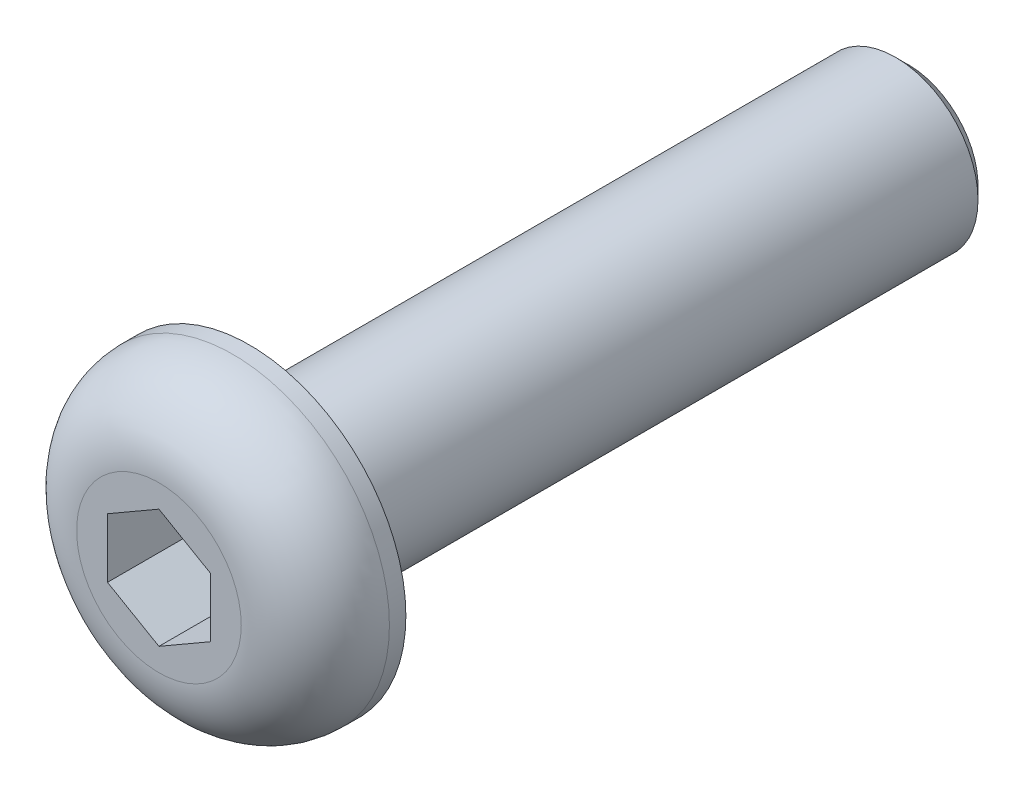
ISO-10303-21;
HEADER;
FILE_DESCRIPTION(('STEP AP214'),'2;1');
FILE_NAME('part.step','',(''),(''),'','','');
FILE_SCHEMA(('AUTOMOTIVE_DESIGN { 1 0 10303 214 1 1 1 1 }'));
ENDSEC;
DATA;
#1=APPLICATION_CONTEXT('core data for automotive mechanical design processes');
#2=APPLICATION_PROTOCOL_DEFINITION('international standard','automotive_design',2000,#1);
#3=PRODUCT_CONTEXT('',#1,'mechanical');
#4=PRODUCT('Part','Part','',(#3));
#5=PRODUCT_RELATED_PRODUCT_CATEGORY('part','',(#4));
#6=PRODUCT_DEFINITION_FORMATION('','',#4);
#7=PRODUCT_DEFINITION_CONTEXT('part definition',#1,'design');
#8=PRODUCT_DEFINITION('design','',#6,#7);
#9=PRODUCT_DEFINITION_SHAPE('','',#8);
#10=(LENGTH_UNIT() NAMED_UNIT(*) SI_UNIT(.MILLI.,.METRE.));
#11=(NAMED_UNIT(*) PLANE_ANGLE_UNIT() SI_UNIT($,.RADIAN.));
#12=(NAMED_UNIT(*) SI_UNIT($,.STERADIAN.) SOLID_ANGLE_UNIT());
#13=UNCERTAINTY_MEASURE_WITH_UNIT(LENGTH_MEASURE(1.E-05),#10,'distance_accuracy_value','');
#14=(GEOMETRIC_REPRESENTATION_CONTEXT(3) GLOBAL_UNCERTAINTY_ASSIGNED_CONTEXT((#13)) GLOBAL_UNIT_ASSIGNED_CONTEXT((#10,
#11,#12)) REPRESENTATION_CONTEXT('',''));
#15=CARTESIAN_POINT('',(0.,0.,0.));
#16=DIRECTION('',(0.,0.,1.));
#17=DIRECTION('',(1.,0.,0.));
#18=AXIS2_PLACEMENT_3D('',#15,#16,#17);
#19=CARTESIAN_POINT('',(0.,0.,0.));
#20=DIRECTION('',(0.,0.,1.));
#21=DIRECTION('',(1.,0.,0.));
#22=AXIS2_PLACEMENT_3D('',#19,#20,#21);
#23=PLANE('',#22);
#24=CARTESIAN_POINT('',(0.,0.,0.));
#25=DIRECTION('',(0.,0.,1.));
#26=DIRECTION('',(1.,0.,0.));
#27=AXIS2_PLACEMENT_3D('',#24,#25,#26);
#28=CIRCLE('',#27,3.8);
#29=CARTESIAN_POINT('',(3.8,0.,0.));
#30=VERTEX_POINT('',#29);
#31=EDGE_CURVE('E136',#30,#30,#28,.T.);
#32=ORIENTED_EDGE('',*,*,#31,.F.);
#33=EDGE_LOOP('',(#32));
#34=FACE_BOUND('',#33,.T.);
#35=CARTESIAN_POINT('',(0.,0.,0.));
#36=DIRECTION('',(0.,0.,1.));
#37=DIRECTION('',(1.,0.,0.));
#38=AXIS2_PLACEMENT_3D('',#35,#36,#37);
#39=CIRCLE('',#38,2.);
#40=CARTESIAN_POINT('',(2.,0.,0.));
#41=VERTEX_POINT('',#40);
#42=EDGE_CURVE('E144',#41,#41,#39,.F.);
#43=ORIENTED_EDGE('',*,*,#42,.F.);
#44=EDGE_LOOP('',(#43));
#45=FACE_BOUND('',#44,.T.);
#46=ADVANCED_FACE('F34',(#34,#45),#23,.F.);
#47=CARTESIAN_POINT('',(0.,0.,2.2));
#48=DIRECTION('',(0.,0.,-1.));
#49=DIRECTION('',(-1.,0.,0.));
#50=AXIS2_PLACEMENT_3D('',#47,#48,#49);
#51=CYLINDRICAL_SURFACE('',#50,3.8);
#52=CARTESIAN_POINT('',(0.,0.,0.4));
#53=DIRECTION('',(0.,0.,1.));
#54=DIRECTION('',(1.,0.,0.));
#55=AXIS2_PLACEMENT_3D('',#52,#53,#54);
#56=CIRCLE('',#55,3.8);
#57=CARTESIAN_POINT('',(3.8,0.,0.4));
#58=VERTEX_POINT('',#57);
#59=EDGE_CURVE('E11',#58,#58,#56,.F.);
#60=ORIENTED_EDGE('',*,*,#59,.T.);
#61=EDGE_LOOP('',(#60));
#62=FACE_BOUND('',#61,.T.);
#63=ORIENTED_EDGE('',*,*,#31,.T.);
#64=EDGE_LOOP('',(#63));
#65=FACE_BOUND('',#64,.T.);
#66=ADVANCED_FACE('F167',(#62,#65),#51,.T.);
#67=CARTESIAN_POINT('',(0.,0.,2.2));
#68=DIRECTION('',(0.,0.,1.));
#69=DIRECTION('',(1.,0.,0.));
#70=AXIS2_PLACEMENT_3D('',#67,#68,#69);
#71=PLANE('',#70);
#72=CARTESIAN_POINT('',(0.,0.,2.2));
#73=DIRECTION('',(0.,0.,1.));
#74=DIRECTION('',(1.,0.,0.));
#75=AXIS2_PLACEMENT_3D('',#72,#73,#74);
#76=CIRCLE('',#75,2.);
#77=CARTESIAN_POINT('',(2.,0.,2.2));
#78=VERTEX_POINT('',#77);
#79=EDGE_CURVE('E42',#78,#78,#76,.T.);
#80=ORIENTED_EDGE('',*,*,#79,.T.);
#81=EDGE_LOOP('',(#80));
#82=FACE_BOUND('',#81,.T.);
#83=DIRECTION('',(-0.866025403784439,0.5,0.));
#84=VECTOR('',#83,1.);
#85=CARTESIAN_POINT('',(1.25,0.721687836487033,2.2));
#86=LINE('',#85,#84);
#87=CARTESIAN_POINT('',(1.25,0.721687836487033,2.2));
#88=VERTEX_POINT('',#87);
#89=CARTESIAN_POINT('',(0.,1.44337567297406,2.2));
#90=VERTEX_POINT('',#89);
#91=EDGE_CURVE('E49',#88,#90,#86,.T.);
#92=ORIENTED_EDGE('',*,*,#91,.F.);
#93=DIRECTION('',(0.,1.,0.));
#94=VECTOR('',#93,1.);
#95=CARTESIAN_POINT('',(1.25,-0.721687836487033,2.2));
#96=LINE('',#95,#94);
#97=CARTESIAN_POINT('',(1.25,-0.721687836487033,2.2));
#98=VERTEX_POINT('',#97);
#99=EDGE_CURVE('E132',#98,#88,#96,.T.);
#100=ORIENTED_EDGE('',*,*,#99,.F.);
#101=DIRECTION('',(0.866025403784439,0.5,0.));
#102=VECTOR('',#101,1.);
#103=CARTESIAN_POINT('',(0.,-1.44337567297406,2.2));
#104=LINE('',#103,#102);
#105=CARTESIAN_POINT('',(0.,-1.44337567297406,2.2));
#106=VERTEX_POINT('',#105);
#107=EDGE_CURVE('E130',#106,#98,#104,.T.);
#108=ORIENTED_EDGE('',*,*,#107,.F.);
#109=DIRECTION('',(0.866025403784439,-0.5,0.));
#110=VECTOR('',#109,1.);
#111=CARTESIAN_POINT('',(-1.25,-0.721687836487032,2.2));
#112=LINE('',#111,#110);
#113=CARTESIAN_POINT('',(-1.25,-0.721687836487032,2.2));
#114=VERTEX_POINT('',#113);
#115=EDGE_CURVE('E97',#114,#106,#112,.T.);
#116=ORIENTED_EDGE('',*,*,#115,.F.);
#117=DIRECTION('',(0.,-1.,0.));
#118=VECTOR('',#117,1.);
#119=CARTESIAN_POINT('',(-1.25,0.721687836487033,2.2));
#120=LINE('',#119,#118);
#121=CARTESIAN_POINT('',(-1.25,0.721687836487033,2.2));
#122=VERTEX_POINT('',#121);
#123=EDGE_CURVE('E126',#122,#114,#120,.T.);
#124=ORIENTED_EDGE('',*,*,#123,.F.);
#125=DIRECTION('',(-0.866025403784439,-0.5,0.));
#126=VECTOR('',#125,1.);
#127=CARTESIAN_POINT('',(0.,1.44337567297406,2.2));
#128=LINE('',#127,#126);
#129=EDGE_CURVE('E123',#90,#122,#128,.T.);
#130=ORIENTED_EDGE('',*,*,#129,.F.);
#131=EDGE_LOOP('',(#92,#100,#108,#116,#124,#130));
#132=FACE_BOUND('',#131,.T.);
#133=ADVANCED_FACE('F155',(#82,#132),#71,.T.);
#134=CARTESIAN_POINT('',(0.,0.,-16.));
#135=DIRECTION('',(0.,0.,1.));
#136=DIRECTION('',(1.,0.,0.));
#137=AXIS2_PLACEMENT_3D('',#134,#135,#136);
#138=CYLINDRICAL_SURFACE('',#137,2.);
#139=CARTESIAN_POINT('',(0.,0.,-15.7));
#140=DIRECTION('',(0.,0.,-1.));
#141=DIRECTION('',(-1.,0.,0.));
#142=AXIS2_PLACEMENT_3D('',#139,#140,#141);
#143=CIRCLE('',#142,2.);
#144=CARTESIAN_POINT('',(-2.,0.,-15.7));
#145=VERTEX_POINT('',#144);
#146=EDGE_CURVE('E150',#145,#145,#143,.F.);
#147=ORIENTED_EDGE('',*,*,#146,.T.);
#148=EDGE_LOOP('',(#147));
#149=FACE_BOUND('',#148,.T.);
#150=ORIENTED_EDGE('',*,*,#42,.T.);
#151=EDGE_LOOP('',(#150));
#152=FACE_BOUND('',#151,.T.);
#153=ADVANCED_FACE('F190',(#149,#152),#138,.T.);
#154=CARTESIAN_POINT('',(0.,0.,-16.));
#155=DIRECTION('',(0.,0.,-1.));
#156=DIRECTION('',(-1.,0.,0.));
#157=AXIS2_PLACEMENT_3D('',#154,#155,#156);
#158=PLANE('',#157);
#159=CARTESIAN_POINT('',(0.,0.,-16.));
#160=DIRECTION('',(0.,0.,-1.));
#161=DIRECTION('',(-1.,0.,0.));
#162=AXIS2_PLACEMENT_3D('',#159,#160,#161);
#163=CIRCLE('',#162,1.70000000000001);
#164=CARTESIAN_POINT('',(-1.70000000000001,0.,-16.));
#165=VERTEX_POINT('',#164);
#166=EDGE_CURVE('E147',#165,#165,#163,.T.);
#167=ORIENTED_EDGE('',*,*,#166,.T.);
#168=EDGE_LOOP('',(#167));
#169=FACE_BOUND('',#168,.T.);
#170=ADVANCED_FACE('F182',(#169),#158,.T.);
#171=CARTESIAN_POINT('',(0.,0.,-16.));
#172=DIRECTION('',(0.,0.,1.));
#173=DIRECTION('',(1.,0.,0.));
#174=AXIS2_PLACEMENT_3D('',#171,#172,#173);
#175=CONICAL_SURFACE('',#174,1.70000000000001,0.785398163397443);
#176=ORIENTED_EDGE('',*,*,#146,.F.);
#177=EDGE_LOOP('',(#176));
#178=FACE_BOUND('',#177,.T.);
#179=ORIENTED_EDGE('',*,*,#166,.F.);
#180=EDGE_LOOP('',(#179));
#181=FACE_BOUND('',#180,.T.);
#182=ADVANCED_FACE('F179',(#178,#181),#175,.T.);
#183=CARTESIAN_POINT('',(1.25,0.721687836487033,0.2));
#184=DIRECTION('',(0.5,0.866025403784439,0.));
#185=DIRECTION('',(-0.866025403784439,0.5,0.));
#186=AXIS2_PLACEMENT_3D('',#183,#184,#185);
#187=PLANE('',#186);
#188=ORIENTED_EDGE('',*,*,#91,.T.);
#189=DIRECTION('',(0.,0.,1.));
#190=VECTOR('',#189,1.);
#191=CARTESIAN_POINT('',(0.,1.44337567297406,0.2));
#192=LINE('',#191,#190);
#193=CARTESIAN_POINT('',(0.,1.44337567297406,0.2));
#194=VERTEX_POINT('',#193);
#195=EDGE_CURVE('E79',#194,#90,#192,.T.);
#196=ORIENTED_EDGE('',*,*,#195,.F.);
#197=DIRECTION('',(-0.866025403784439,0.5,0.));
#198=VECTOR('',#197,1.);
#199=CARTESIAN_POINT('',(1.25,0.721687836487033,0.2));
#200=LINE('',#199,#198);
#201=CARTESIAN_POINT('',(1.25,0.721687836487033,0.2));
#202=VERTEX_POINT('',#201);
#203=EDGE_CURVE('E134',#202,#194,#200,.T.);
#204=ORIENTED_EDGE('',*,*,#203,.F.);
#205=DIRECTION('',(0.,0.,1.));
#206=VECTOR('',#205,1.);
#207=CARTESIAN_POINT('',(1.25,0.721687836487033,0.2));
#208=LINE('',#207,#206);
#209=EDGE_CURVE('E57',#202,#88,#208,.T.);
#210=ORIENTED_EDGE('',*,*,#209,.T.);
#211=EDGE_LOOP('',(#188,#196,#204,#210));
#212=FACE_BOUND('',#211,.T.);
#213=ADVANCED_FACE('F181',(#212),#187,.F.);
#214=CARTESIAN_POINT('',(1.25,-0.721687836487033,0.2));
#215=DIRECTION('',(1.,0.,0.));
#216=DIRECTION('',(0.,1.,0.));
#217=AXIS2_PLACEMENT_3D('',#214,#215,#216);
#218=PLANE('',#217);
#219=ORIENTED_EDGE('',*,*,#99,.T.);
#220=ORIENTED_EDGE('',*,*,#209,.F.);
#221=DIRECTION('',(0.,1.,0.));
#222=VECTOR('',#221,1.);
#223=CARTESIAN_POINT('',(1.25,-0.721687836487033,0.2));
#224=LINE('',#223,#222);
#225=CARTESIAN_POINT('',(1.25,-0.721687836487033,0.2));
#226=VERTEX_POINT('',#225);
#227=EDGE_CURVE('E109',#226,#202,#224,.T.);
#228=ORIENTED_EDGE('',*,*,#227,.F.);
#229=DIRECTION('',(0.,0.,1.));
#230=VECTOR('',#229,1.);
#231=CARTESIAN_POINT('',(1.25,-0.721687836487033,0.2));
#232=LINE('',#231,#230);
#233=EDGE_CURVE('E101',#226,#98,#232,.T.);
#234=ORIENTED_EDGE('',*,*,#233,.T.);
#235=EDGE_LOOP('',(#219,#220,#228,#234));
#236=FACE_BOUND('',#235,.T.);
#237=ADVANCED_FACE('F188',(#236),#218,.F.);
#238=CARTESIAN_POINT('',(0.,-1.44337567297406,0.2));
#239=DIRECTION('',(0.5,-0.866025403784439,0.));
#240=DIRECTION('',(0.866025403784439,0.5,0.));
#241=AXIS2_PLACEMENT_3D('',#238,#239,#240);
#242=PLANE('',#241);
#243=ORIENTED_EDGE('',*,*,#107,.T.);
#244=ORIENTED_EDGE('',*,*,#233,.F.);
#245=DIRECTION('',(0.866025403784439,0.5,0.));
#246=VECTOR('',#245,1.);
#247=CARTESIAN_POINT('',(0.,-1.44337567297406,0.2));
#248=LINE('',#247,#246);
#249=CARTESIAN_POINT('',(0.,-1.44337567297406,0.2));
#250=VERTEX_POINT('',#249);
#251=EDGE_CURVE('E105',#250,#226,#248,.T.);
#252=ORIENTED_EDGE('',*,*,#251,.F.);
#253=DIRECTION('',(0.,0.,1.));
#254=VECTOR('',#253,1.);
#255=CARTESIAN_POINT('',(0.,-1.44337567297406,0.2));
#256=LINE('',#255,#254);
#257=EDGE_CURVE('E90',#250,#106,#256,.T.);
#258=ORIENTED_EDGE('',*,*,#257,.T.);
#259=EDGE_LOOP('',(#243,#244,#252,#258));
#260=FACE_BOUND('',#259,.T.);
#261=ADVANCED_FACE('F106',(#260),#242,.F.);
#262=CARTESIAN_POINT('',(-1.25,-0.721687836487032,0.2));
#263=DIRECTION('',(-0.5,-0.866025403784439,0.));
#264=DIRECTION('',(0.866025403784439,-0.5,0.));
#265=AXIS2_PLACEMENT_3D('',#262,#263,#264);
#266=PLANE('',#265);
#267=ORIENTED_EDGE('',*,*,#115,.T.);
#268=ORIENTED_EDGE('',*,*,#257,.F.);
#269=DIRECTION('',(0.866025403784439,-0.5,0.));
#270=VECTOR('',#269,1.);
#271=CARTESIAN_POINT('',(-1.25,-0.721687836487032,0.2));
#272=LINE('',#271,#270);
#273=CARTESIAN_POINT('',(-1.25,-0.721687836487032,0.2));
#274=VERTEX_POINT('',#273);
#275=EDGE_CURVE('E94',#274,#250,#272,.T.);
#276=ORIENTED_EDGE('',*,*,#275,.F.);
#277=DIRECTION('',(0.,0.,1.));
#278=VECTOR('',#277,1.);
#279=CARTESIAN_POINT('',(-1.25,-0.721687836487032,0.2));
#280=LINE('',#279,#278);
#281=EDGE_CURVE('E102',#274,#114,#280,.T.);
#282=ORIENTED_EDGE('',*,*,#281,.T.);
#283=EDGE_LOOP('',(#267,#268,#276,#282));
#284=FACE_BOUND('',#283,.T.);
#285=ADVANCED_FACE('F92',(#284),#266,.F.);
#286=CARTESIAN_POINT('',(-1.25,0.721687836487033,0.2));
#287=DIRECTION('',(-1.,0.,0.));
#288=DIRECTION('',(0.,0.,1.));
#289=AXIS2_PLACEMENT_3D('',#286,#287,#288);
#290=PLANE('',#289);
#291=ORIENTED_EDGE('',*,*,#123,.T.);
#292=ORIENTED_EDGE('',*,*,#281,.F.);
#293=DIRECTION('',(0.,-1.,0.));
#294=VECTOR('',#293,1.);
#295=CARTESIAN_POINT('',(-1.25,0.721687836487033,0.2));
#296=LINE('',#295,#294);
#297=CARTESIAN_POINT('',(-1.25,0.721687836487033,0.2));
#298=VERTEX_POINT('',#297);
#299=EDGE_CURVE('E115',#298,#274,#296,.T.);
#300=ORIENTED_EDGE('',*,*,#299,.F.);
#301=DIRECTION('',(0.,0.,1.));
#302=VECTOR('',#301,1.);
#303=CARTESIAN_POINT('',(-1.25,0.721687836487033,0.2));
#304=LINE('',#303,#302);
#305=EDGE_CURVE('E139',#298,#122,#304,.T.);
#306=ORIENTED_EDGE('',*,*,#305,.T.);
#307=EDGE_LOOP('',(#291,#292,#300,#306));
#308=FACE_BOUND('',#307,.T.);
#309=ADVANCED_FACE('F206',(#308),#290,.F.);
#310=CARTESIAN_POINT('',(0.,1.44337567297406,0.2));
#311=DIRECTION('',(-0.5,0.866025403784439,0.));
#312=DIRECTION('',(-0.866025403784439,-0.5,0.));
#313=AXIS2_PLACEMENT_3D('',#310,#311,#312);
#314=PLANE('',#313);
#315=ORIENTED_EDGE('',*,*,#129,.T.);
#316=ORIENTED_EDGE('',*,*,#305,.F.);
#317=DIRECTION('',(-0.866025403784439,-0.5,0.));
#318=VECTOR('',#317,1.);
#319=CARTESIAN_POINT('',(0.,1.44337567297406,0.2));
#320=LINE('',#319,#318);
#321=EDGE_CURVE('E117',#194,#298,#320,.T.);
#322=ORIENTED_EDGE('',*,*,#321,.F.);
#323=ORIENTED_EDGE('',*,*,#195,.T.);
#324=EDGE_LOOP('',(#315,#316,#322,#323));
#325=FACE_BOUND('',#324,.T.);
#326=ADVANCED_FACE('F163',(#325),#314,.F.);
#327=CARTESIAN_POINT('',(0.,0.,0.2));
#328=DIRECTION('',(0.,0.,1.));
#329=DIRECTION('',(1.,0.,0.));
#330=AXIS2_PLACEMENT_3D('',#327,#328,#329);
#331=PLANE('',#330);
#332=ORIENTED_EDGE('',*,*,#203,.T.);
#333=ORIENTED_EDGE('',*,*,#321,.T.);
#334=ORIENTED_EDGE('',*,*,#299,.T.);
#335=ORIENTED_EDGE('',*,*,#275,.T.);
#336=ORIENTED_EDGE('',*,*,#251,.T.);
#337=ORIENTED_EDGE('',*,*,#227,.T.);
#338=EDGE_LOOP('',(#332,#333,#334,#335,#336,#337));
#339=FACE_BOUND('',#338,.T.);
#340=ADVANCED_FACE('F112',(#339),#331,.T.);
#341=CARTESIAN_POINT('',(0.,0.,0.4));
#342=DIRECTION('',(0.,0.,1.));
#343=DIRECTION('',(1.,0.,0.));
#344=AXIS2_PLACEMENT_3D('',#341,#342,#343);
#345=TOROIDAL_SURFACE('',#344,2.,1.8);
#346=ORIENTED_EDGE('',*,*,#59,.F.);
#347=EDGE_LOOP('',(#346));
#348=FACE_BOUND('',#347,.T.);
#349=ORIENTED_EDGE('',*,*,#79,.F.);
#350=EDGE_LOOP('',(#349));
#351=FACE_BOUND('',#350,.T.);
#352=ADVANCED_FACE('F36',(#348,#351),#345,.T.);
#353=CLOSED_SHELL('',(#46,#66,#133,#153,#170,#182,#213,#237,#261,#285,#309,#326,#340,#352));
#354=MANIFOLD_SOLID_BREP('B2',#353);
#355=ADVANCED_BREP_SHAPE_REPRESENTATION('',(#18,#354),#14);
#356=SHAPE_DEFINITION_REPRESENTATION(#9,#355);
ENDSEC;
END-ISO-10303-21;
